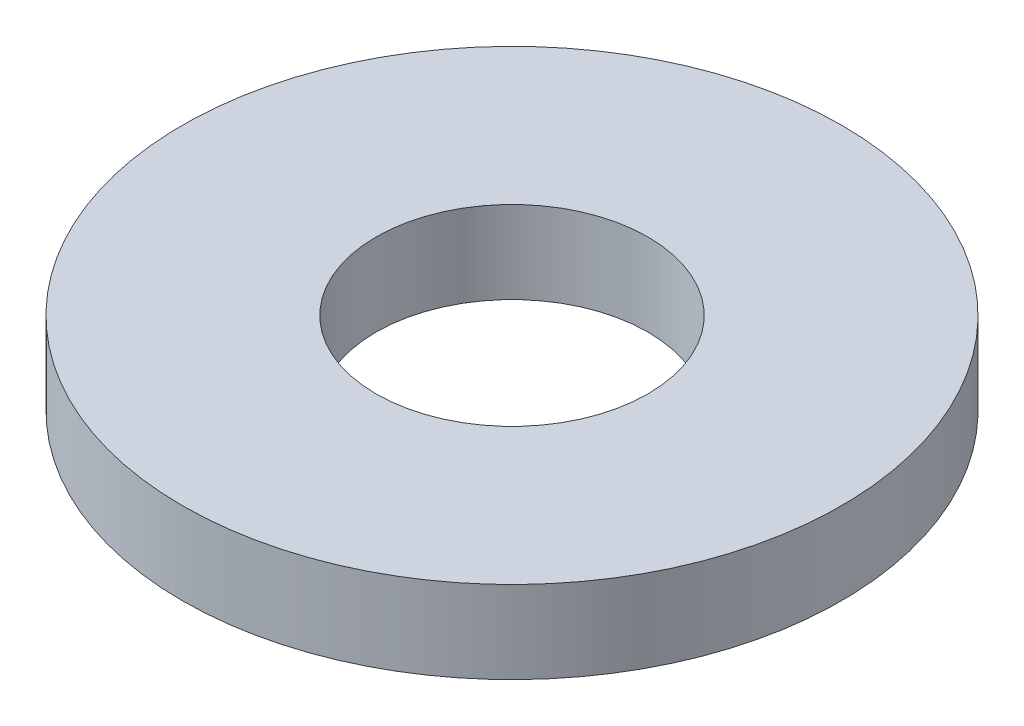
ISO-10303-21;
HEADER;
FILE_DESCRIPTION(('STEP AP214'),'2;1');
FILE_NAME('part.step','',(''),(''),'','','');
FILE_SCHEMA(('AUTOMOTIVE_DESIGN { 1 0 10303 214 1 1 1 1 }'));
ENDSEC;
DATA;
#1=APPLICATION_CONTEXT('core data for automotive mechanical design processes');
#2=APPLICATION_PROTOCOL_DEFINITION('international standard','automotive_design',2000,#1);
#3=PRODUCT_CONTEXT('',#1,'mechanical');
#4=PRODUCT('Part','Part','',(#3));
#5=PRODUCT_RELATED_PRODUCT_CATEGORY('part','',(#4));
#6=PRODUCT_DEFINITION_FORMATION('','',#4);
#7=PRODUCT_DEFINITION_CONTEXT('part definition',#1,'design');
#8=PRODUCT_DEFINITION('design','',#6,#7);
#9=PRODUCT_DEFINITION_SHAPE('','',#8);
#10=(LENGTH_UNIT() NAMED_UNIT(*) SI_UNIT(.MILLI.,.METRE.));
#11=(NAMED_UNIT(*) PLANE_ANGLE_UNIT() SI_UNIT($,.RADIAN.));
#12=(NAMED_UNIT(*) SI_UNIT($,.STERADIAN.) SOLID_ANGLE_UNIT());
#13=UNCERTAINTY_MEASURE_WITH_UNIT(LENGTH_MEASURE(1.E-05),#10,'distance_accuracy_value','');
#14=(GEOMETRIC_REPRESENTATION_CONTEXT(3) GLOBAL_UNCERTAINTY_ASSIGNED_CONTEXT((#13)) GLOBAL_UNIT_ASSIGNED_CONTEXT((#10,
#11,#12)) REPRESENTATION_CONTEXT('',''));
#15=CARTESIAN_POINT('',(0.,0.,0.));
#16=DIRECTION('',(0.,0.,1.));
#17=DIRECTION('',(1.,0.,0.));
#18=AXIS2_PLACEMENT_3D('',#15,#16,#17);
#19=CARTESIAN_POINT('',(0.,1.,0.));
#20=DIRECTION('',(0.,-1.,0.));
#21=DIRECTION('',(0.,0.,-1.));
#22=AXIS2_PLACEMENT_3D('',#19,#20,#21);
#23=CYLINDRICAL_SURFACE('',#22,4.);
#24=CARTESIAN_POINT('',(0.,1.,0.));
#25=DIRECTION('',(0.,1.,0.));
#26=DIRECTION('',(0.,0.,1.));
#27=AXIS2_PLACEMENT_3D('',#24,#25,#26);
#28=CIRCLE('',#27,4.);
#29=CARTESIAN_POINT('',(0.,1.,4.));
#30=VERTEX_POINT('',#29);
#31=EDGE_CURVE('E10',#30,#30,#28,.T.);
#32=ORIENTED_EDGE('',*,*,#31,.F.);
#33=EDGE_LOOP('',(#32));
#34=FACE_BOUND('',#33,.T.);
#35=CARTESIAN_POINT('',(0.,0.,0.));
#36=DIRECTION('',(0.,1.,0.));
#37=DIRECTION('',(0.,0.,1.));
#38=AXIS2_PLACEMENT_3D('',#35,#36,#37);
#39=CIRCLE('',#38,4.);
#40=CARTESIAN_POINT('',(0.,0.,4.));
#41=VERTEX_POINT('',#40);
#42=EDGE_CURVE('E46',#41,#41,#39,.T.);
#43=ORIENTED_EDGE('',*,*,#42,.T.);
#44=EDGE_LOOP('',(#43));
#45=FACE_BOUND('',#44,.T.);
#46=ADVANCED_FACE('F43',(#34,#45),#23,.T.);
#47=CARTESIAN_POINT('',(0.,1.,0.));
#48=DIRECTION('',(0.,1.,0.));
#49=DIRECTION('',(0.,0.,1.));
#50=AXIS2_PLACEMENT_3D('',#47,#48,#49);
#51=PLANE('',#50);
#52=CARTESIAN_POINT('',(0.,1.,0.));
#53=DIRECTION('',(0.,1.,0.));
#54=DIRECTION('',(0.,0.,1.));
#55=AXIS2_PLACEMENT_3D('',#52,#53,#54);
#56=CIRCLE('',#55,1.65);
#57=CARTESIAN_POINT('',(0.,1.,1.65));
#58=VERTEX_POINT('',#57);
#59=EDGE_CURVE('E57',#58,#58,#56,.T.);
#60=ORIENTED_EDGE('',*,*,#59,.F.);
#61=EDGE_LOOP('',(#60));
#62=FACE_BOUND('',#61,.T.);
#63=ORIENTED_EDGE('',*,*,#31,.T.);
#64=EDGE_LOOP('',(#63));
#65=FACE_BOUND('',#64,.T.);
#66=ADVANCED_FACE('F74',(#62,#65),#51,.T.);
#67=CARTESIAN_POINT('',(0.,0.,0.));
#68=DIRECTION('',(0.,1.,0.));
#69=DIRECTION('',(0.,0.,1.));
#70=AXIS2_PLACEMENT_3D('',#67,#68,#69);
#71=PLANE('',#70);
#72=CARTESIAN_POINT('',(0.,0.,0.));
#73=DIRECTION('',(0.,1.,0.));
#74=DIRECTION('',(0.,0.,1.));
#75=AXIS2_PLACEMENT_3D('',#72,#73,#74);
#76=CIRCLE('',#75,1.65);
#77=CARTESIAN_POINT('',(0.,0.,1.65));
#78=VERTEX_POINT('',#77);
#79=EDGE_CURVE('E55',#78,#78,#76,.T.);
#80=ORIENTED_EDGE('',*,*,#79,.T.);
#81=EDGE_LOOP('',(#80));
#82=FACE_BOUND('',#81,.T.);
#83=ORIENTED_EDGE('',*,*,#42,.F.);
#84=EDGE_LOOP('',(#83));
#85=FACE_BOUND('',#84,.T.);
#86=ADVANCED_FACE('F65',(#82,#85),#71,.F.);
#87=CARTESIAN_POINT('',(0.,0.,0.));
#88=DIRECTION('',(0.,1.,0.));
#89=DIRECTION('',(0.,0.,1.));
#90=AXIS2_PLACEMENT_3D('',#87,#88,#89);
#91=CYLINDRICAL_SURFACE('',#90,1.65);
#92=ORIENTED_EDGE('',*,*,#79,.F.);
#93=EDGE_LOOP('',(#92));
#94=FACE_BOUND('',#93,.T.);
#95=ORIENTED_EDGE('',*,*,#59,.T.);
#96=EDGE_LOOP('',(#95));
#97=FACE_BOUND('',#96,.T.);
#98=ADVANCED_FACE('F68',(#94,#97),#91,.F.);
#99=CLOSED_SHELL('',(#46,#66,#86,#98));
#100=MANIFOLD_SOLID_BREP('B2',#99);
#101=ADVANCED_BREP_SHAPE_REPRESENTATION('',(#18,#100),#14);
#102=SHAPE_DEFINITION_REPRESENTATION(#9,#101);
ENDSEC;
END-ISO-10303-21;
